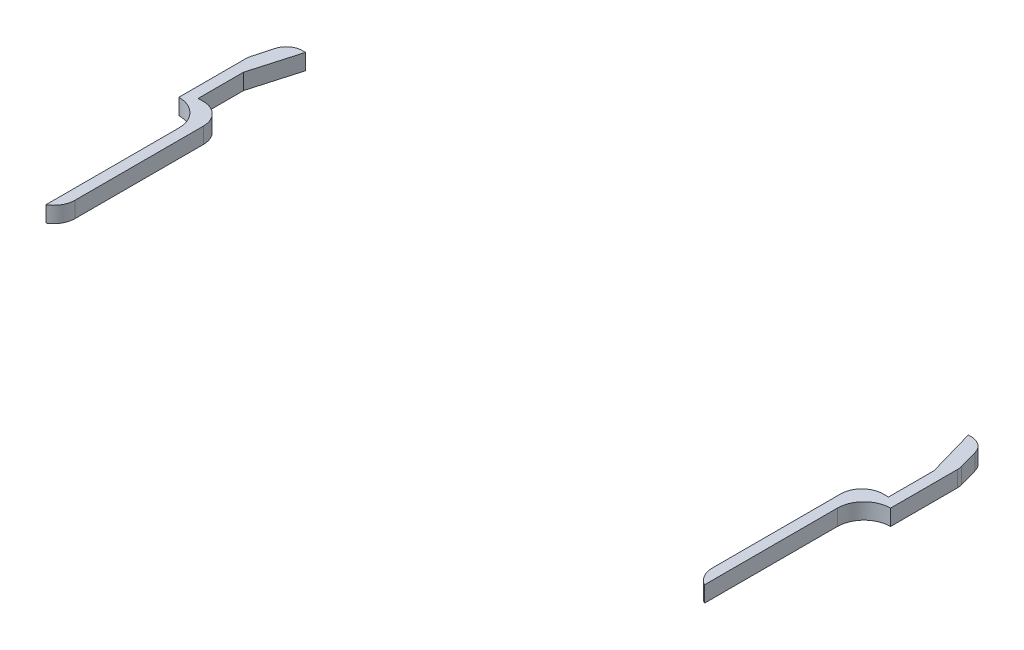
ISO-10303-21;
HEADER;
FILE_DESCRIPTION(('STEP AP214'),'2;1');
FILE_NAME('part.step','',(''),(''),'','','');
FILE_SCHEMA(('AUTOMOTIVE_DESIGN { 1 0 10303 214 1 1 1 1 }'));
ENDSEC;
DATA;
#1=APPLICATION_CONTEXT('core data for automotive mechanical design processes');
#2=APPLICATION_PROTOCOL_DEFINITION('international standard','automotive_design',2000,#1);
#3=PRODUCT_CONTEXT('',#1,'mechanical');
#4=PRODUCT('Part','Part','',(#3));
#5=PRODUCT_RELATED_PRODUCT_CATEGORY('part','',(#4));
#6=PRODUCT_DEFINITION_FORMATION('','',#4);
#7=PRODUCT_DEFINITION_CONTEXT('part definition',#1,'design');
#8=PRODUCT_DEFINITION('design','',#6,#7);
#9=PRODUCT_DEFINITION_SHAPE('','',#8);
#10=(LENGTH_UNIT() NAMED_UNIT(*) SI_UNIT(.MILLI.,.METRE.));
#11=(NAMED_UNIT(*) PLANE_ANGLE_UNIT() SI_UNIT($,.RADIAN.));
#12=(NAMED_UNIT(*) SI_UNIT($,.STERADIAN.) SOLID_ANGLE_UNIT());
#13=UNCERTAINTY_MEASURE_WITH_UNIT(LENGTH_MEASURE(1.E-05),#10,'distance_accuracy_value','');
#14=(GEOMETRIC_REPRESENTATION_CONTEXT(3) GLOBAL_UNCERTAINTY_ASSIGNED_CONTEXT((#13)) GLOBAL_UNIT_ASSIGNED_CONTEXT((#10,
#11,#12)) REPRESENTATION_CONTEXT('',''));
#15=CARTESIAN_POINT('',(0.,0.,0.));
#16=DIRECTION('',(0.,0.,1.));
#17=DIRECTION('',(1.,0.,0.));
#18=AXIS2_PLACEMENT_3D('',#15,#16,#17);
#19=CARTESIAN_POINT('',(3.344867395618,0.09847099073796,-1.724494712276));
#20=DIRECTION('',(0.,-1.,-4.115780449305E-12));
#21=DIRECTION('',(-0.999999768712327,0.,-0.000680128879099023));
#22=AXIS2_PLACEMENT_3D('',#19,#20,#21);
#23=CYLINDRICAL_SURFACE('',#22,0.25000000038);
#24=DIRECTION('',(-1.13301960372813E-11,-0.999999999724119,-2.34896254214928E-05));
#25=VECTOR('',#24,1.);
#26=CARTESIAN_POINT('',(3.094867750157,0.17347099085,-1.724659966049));
#27=LINE('',#26,#25);
#28=CARTESIAN_POINT('',(3.09486754473,0.173470990849,-1.724659966109));
#29=VERTEX_POINT('',#28);
#30=CARTESIAN_POINT('',(3.094867545513,0.0234709908457,-1.724663489553));
#31=VERTEX_POINT('',#30);
#32=EDGE_CURVE('P0_E265',#29,#31,#27,.T.);
#33=ORIENTED_EDGE('',*,*,#32,.T.);
#34=CARTESIAN_POINT('',(3.344867395618,0.02347099073796,-1.724494712276));
#35=DIRECTION('',(0.,1.,4.115780449305E-12));
#36=DIRECTION('',(-2.04079998811896E-07,4.11578044930492E-12,-0.999999999999979));
#37=AXIS2_PLACEMENT_3D('',#34,#35,#36);
#38=CIRCLE('',#37,0.25000000038);
#39=CARTESIAN_POINT('',(3.344867344598,0.02347099073899,-1.974494712656));
#40=VERTEX_POINT('',#39);
#41=EDGE_CURVE('P0_E197',#40,#31,#38,.T.);
#42=ORIENTED_EDGE('',*,*,#41,.F.);
#43=DIRECTION('',(0.,1.,2.563875038154E-12));
#44=VECTOR('',#43,1.);
#45=CARTESIAN_POINT('',(3.344867344598,0.02347099082296,-1.974494712656));
#46=LINE('',#45,#44);
#47=CARTESIAN_POINT('',(3.344867344598,0.173470990826,-1.974494712655));
#48=VERTEX_POINT('',#47);
#49=EDGE_CURVE('P0_E11',#40,#48,#46,.T.);
#50=ORIENTED_EDGE('',*,*,#49,.T.);
#51=CARTESIAN_POINT('',(3.344867395618,0.173470990738,-1.724494712275));
#52=DIRECTION('',(0.,-1.,-4.115780449305E-12));
#53=DIRECTION('',(-0.999999778692739,0.,-0.000665292772003927));
#54=AXIS2_PLACEMENT_3D('',#51,#52,#53);
#55=CIRCLE('',#54,0.25000000038);
#56=EDGE_CURVE('P0_E259',#29,#48,#55,.T.);
#57=ORIENTED_EDGE('',*,*,#56,.F.);
#58=EDGE_LOOP('',(#33,#42,#50,#57));
#59=FACE_BOUND('',#58,.T.);
#60=ADVANCED_FACE('P0_F17',(#59),#23,.F.);
#61=CARTESIAN_POINT('',(3.344867344598,0.09847099073978,-2.165876948645));
#62=DIRECTION('',(-1.,0.,0.));
#63=DIRECTION('',(0.,0.,1.));
#64=AXIS2_PLACEMENT_3D('',#61,#62,#63);
#65=PLANE('',#64);
#66=DIRECTION('',(0.,-1.370347422609E-12,1.));
#67=VECTOR('',#66,1.);
#68=CARTESIAN_POINT('',(3.344867344598,0.173470990827,-2.604892903076));
#69=LINE('',#68,#67);
#70=CARTESIAN_POINT('',(3.344867344598,0.173470990827,-2.604892903076));
#71=VERTEX_POINT('',#70);
#72=EDGE_CURVE('P0_E254',#71,#48,#69,.T.);
#73=ORIENTED_EDGE('',*,*,#72,.T.);
#74=ORIENTED_EDGE('',*,*,#49,.F.);
#75=DIRECTION('',(0.,1.118206402738E-12,-1.));
#76=VECTOR('',#75,1.);
#77=CARTESIAN_POINT('',(3.344867344598,0.02347099082296,-1.974494712656));
#78=LINE('',#77,#76);
#79=CARTESIAN_POINT('',(3.344867344598,0.02347099082367,-2.604892903077));
#80=VERTEX_POINT('',#79);
#81=EDGE_CURVE('P0_E202',#40,#80,#78,.T.);
#82=ORIENTED_EDGE('',*,*,#81,.T.);
#83=DIRECTION('',(0.,-1.,-4.967877960759E-12));
#84=VECTOR('',#83,1.);
#85=CARTESIAN_POINT('',(3.344867344598,0.173470990827,-2.604892903076));
#86=LINE('',#85,#84);
#87=EDGE_CURVE('P0_E28',#71,#80,#86,.T.);
#88=ORIENTED_EDGE('',*,*,#87,.F.);
#89=EDGE_LOOP('',(#73,#74,#82,#88));
#90=FACE_BOUND('',#89,.T.);
#91=ADVANCED_FACE('P0_F328',(#90),#65,.F.);
#92=CARTESIAN_POINT('',(3.194867344598,-0.172069009258,-2.604892903077));
#93=DIRECTION('',(0.,1.,4.115780449305E-12));
#94=DIRECTION('',(1.,0.,0.));
#95=AXIS2_PLACEMENT_3D('',#92,#93,#94);
#96=CYLINDRICAL_SURFACE('',#95,0.15);
#97=ORIENTED_EDGE('',*,*,#87,.T.);
#98=CARTESIAN_POINT('',(3.194867344598,0.02347099074158,-2.604892903077));
#99=DIRECTION('',(0.,-1.,-4.11578044930542E-12));
#100=DIRECTION('',(0.963419049721258,1.1030271227503E-12,-0.267999504914072));
#101=AXIS2_PLACEMENT_3D('',#98,#99,#100);
#102=CIRCLE('',#101,0.15);
#103=CARTESIAN_POINT('',(3.339380202057,0.02347099074175,-2.645092828814));
#104=VERTEX_POINT('',#103);
#105=EDGE_CURVE('P0_E244',#104,#80,#102,.T.);
#106=ORIENTED_EDGE('',*,*,#105,.F.);
#107=DIRECTION('',(-3.046451979511E-12,1.,-8.21268978733E-12));
#108=VECTOR('',#107,1.);
#109=CARTESIAN_POINT('',(3.33938020206,0.02347099082334,-2.645092828805));
#110=LINE('',#109,#108);
#111=CARTESIAN_POINT('',(3.33938020206,0.173470990826,-2.645092828806));
#112=VERTEX_POINT('',#111);
#113=EDGE_CURVE('P0_E284',#104,#112,#110,.T.);
#114=ORIENTED_EDGE('',*,*,#113,.T.);
#115=CARTESIAN_POINT('',(3.194867344598,0.173470990742,-2.604892903076));
#116=DIRECTION('',(0.,1.,4.115780449305E-12));
#117=DIRECTION('',(1.,0.,-2.812564995717E-12));
#118=AXIS2_PLACEMENT_3D('',#115,#116,#117);
#119=CIRCLE('',#118,0.15);
#120=EDGE_CURVE('P0_E258',#71,#112,#119,.T.);
#121=ORIENTED_EDGE('',*,*,#120,.F.);
#122=EDGE_LOOP('',(#97,#106,#114,#121));
#123=FACE_BOUND('',#122,.T.);
#124=ADVANCED_FACE('P0_F326',(#123),#96,.T.);
#125=CARTESIAN_POINT('',(3.258820051655,0.02347099074294,-2.934694795061));
#126=DIRECTION('',(0.963419049747726,1.10290913755269E-12,-0.267999504818924));
#127=DIRECTION('',(0.,-1.,-4.11534020668388E-12));
#128=AXIS2_PLACEMENT_3D('',#125,#126,#127);
#129=PLANE('',#128);
#130=DIRECTION('',(-0.267999504816139,2.55085621103232E-12,-0.963419049748501));
#131=VECTOR('',#130,1.);
#132=CARTESIAN_POINT('',(3.33938020206,0.173470990826,-2.645092828806));
#133=LINE('',#132,#131);
#134=CARTESIAN_POINT('',(3.289363734121,0.173470990827,-2.824894720775));
#135=VERTEX_POINT('',#134);
#136=EDGE_CURVE('P0_E277',#112,#135,#133,.T.);
#137=ORIENTED_EDGE('',*,*,#136,.F.);
#138=ORIENTED_EDGE('',*,*,#113,.F.);
#139=DIRECTION('',(0.267999504817068,-2.3530577757056E-12,0.963419049748243));
#140=VECTOR('',#139,1.);
#141=CARTESIAN_POINT('',(3.289363734119,0.02347099082378,-2.824894720783));
#142=LINE('',#141,#140);
#143=CARTESIAN_POINT('',(3.289363734119,0.02347099082378,-2.824894720783));
#144=VERTEX_POINT('',#143);
#145=EDGE_CURVE('P0_E249',#144,#104,#142,.T.);
#146=ORIENTED_EDGE('',*,*,#145,.F.);
#147=DIRECTION('',(-1.379045026293E-11,-1.,-5.232555129821E-11));
#148=VECTOR('',#147,1.);
#149=CARTESIAN_POINT('',(3.289363734121,0.173470990827,-2.824894720775));
#150=LINE('',#149,#148);
#151=EDGE_CURVE('P0_E52',#135,#144,#150,.T.);
#152=ORIENTED_EDGE('',*,*,#151,.F.);
#153=EDGE_LOOP('',(#137,#138,#146,#152));
#154=FACE_BOUND('',#153,.T.);
#155=ADVANCED_FACE('P0_F321',(#154),#129,.T.);
#156=CARTESIAN_POINT('',(3.144850876657,-0.172069009258,-2.784694795061));
#157=DIRECTION('',(0.,1.,4.11578044930515E-12));
#158=DIRECTION('',(0.963419049747726,1.10302712235769E-12,-0.267999504818924));
#159=AXIS2_PLACEMENT_3D('',#156,#157,#158);
#160=CYLINDRICAL_SURFACE('',#159,0.15);
#161=ORIENTED_EDGE('',*,*,#151,.T.);
#162=CARTESIAN_POINT('',(3.144850876657,0.02347099048028,-2.78469479506));
#163=DIRECTION('',(1.69860183147825E-09,-1.,-2.43851371294279E-09));
#164=DIRECTION('',(0.963419049747726,2.28998582994535E-09,-0.267999504818924));
#165=AXIS2_PLACEMENT_3D('',#162,#163,#164);
#166=CIRCLE('',#165,0.15);
#167=CARTESIAN_POINT('',(3.144250396063,0.02347099113924,-2.935001132263));
#168=VERTEX_POINT('',#167);
#169=EDGE_CURVE('P0_E253',#168,#144,#166,.T.);
#170=ORIENTED_EDGE('',*,*,#169,.F.);
#171=CARTESIAN_POINT('',(3.14426354898063,0.0234709911392389,-2.93469364520979));
#172=CARTESIAN_POINT('',(3.14426354898068,0.0297209911271455,-2.93469364520976));
#173=CARTESIAN_POINT('',(3.14426354898074,0.0359709911150522,-2.93469364520974));
#174=CARTESIAN_POINT('',(3.14426354898085,0.0484709910908655,-2.93469364520969));
#175=CARTESIAN_POINT('',(3.14426354898091,0.0547209910787722,-2.93469364520966));
#176=CARTESIAN_POINT('',(3.14426354898102,0.0672209910545855,-2.93469364520961));
#177=CARTESIAN_POINT('',(3.14426354898108,0.0734709910424922,-2.93469364520959));
#178=CARTESIAN_POINT('',(3.14426354898119,0.0859709910183055,-2.93469364520953));
#179=CARTESIAN_POINT('',(3.14426354898124,0.0922209910062122,-2.93469364520951));
#180=CARTESIAN_POINT('',(3.14426354898136,0.104720990982026,-2.93469364520946));
#181=CARTESIAN_POINT('',(3.14426354898141,0.110970990969932,-2.93469364520943));
#182=CARTESIAN_POINT('',(3.14426354898152,0.123470990945745,-2.93469364520938));
#183=CARTESIAN_POINT('',(3.14426354898158,0.129720990933652,-2.93469364520936));
#184=CARTESIAN_POINT('',(3.14426354898169,0.142220990909465,-2.93469364520931));
#185=CARTESIAN_POINT('',(3.14426354898175,0.148470990897372,-2.93469364520928));
#186=CARTESIAN_POINT('',(3.14426354898186,0.160970990873185,-2.93469364520923));
#187=CARTESIAN_POINT('',(3.14426354898192,0.167220990861092,-2.9346936452092));
#188=CARTESIAN_POINT('',(3.14426354898197,0.173470990848999,-2.93469364520918));
#189=B_SPLINE_CURVE_WITH_KNOTS('',3,(#171,#172,#173,#174,#175,#176,#177,#178,#179,#180,#181,
#182,#183,#184,#185,#186,#187,#188),.UNSPECIFIED.,.F.,.F.,(4,2,2,2,2,2,2,2,4),(0.,
0.01874999996372,0.03749999992744,0.0562499998911599,0.07499999985488,0.0937499998186,
0.11249999978232,0.13124999974604,0.14999999970976),.UNSPECIFIED.);
#190=CARTESIAN_POINT('',(3.144250396065,0.173470990849,-2.935001132262));
#191=VERTEX_POINT('',#190);
#192=EDGE_CURVE('P0_E41',#168,#191,#189,.T.);
#193=ORIENTED_EDGE('',*,*,#192,.T.);
#194=CARTESIAN_POINT('',(3.144850876657,0.17347099047,-2.78469479506));
#195=DIRECTION('',(-1.763157427369E-09,1.,2.53038077356571E-09));
#196=DIRECTION('',(-0.00391551783583466,2.52345770214914E-09,-0.999992334330657));
#197=AXIS2_PLACEMENT_3D('',#194,#195,#196);
#198=CIRCLE('',#197,0.15);
#199=EDGE_CURVE('P0_E281',#135,#191,#198,.T.);
#200=ORIENTED_EDGE('',*,*,#199,.F.);
#201=EDGE_LOOP('',(#161,#170,#193,#200));
#202=FACE_BOUND('',#201,.T.);
#203=ADVANCED_FACE('P0_F310',(#202),#160,.T.);
#204=CARTESIAN_POINT('',(2.619562849071,0.04847099094063,-2.9352118108));
#205=DIRECTION('',(0.,2.925491021119E-12,1.));
#206=DIRECTION('',(0.,-1.,2.925491021119E-12));
#207=AXIS2_PLACEMENT_3D('',#204,#205,#206);
#208=PLANE('',#207);
#209=DIRECTION('',(-1.,2.195915677822E-09,0.));
#210=VECTOR('',#209,1.);
#211=CARTESIAN_POINT('',(3.144262342351,0.173470990849,-2.9352118108));
#212=LINE('',#211,#210);
#213=CARTESIAN_POINT('',(3.115071497197,0.173470990913,-2.935211810801));
#214=VERTEX_POINT('',#213);
#215=EDGE_CURVE('P0_E287',#191,#214,#212,.T.);
#216=ORIENTED_EDGE('',*,*,#215,.F.);
#217=ORIENTED_EDGE('',*,*,#192,.F.);
#218=DIRECTION('',(1.,-2.118836520799E-09,0.));
#219=VECTOR('',#218,1.);
#220=CARTESIAN_POINT('',(3.115071497196,0.02347099090691,-2.9352118108));
#221=LINE('',#220,#219);
#222=CARTESIAN_POINT('',(3.115071497196,0.02347099090691,-2.9352118108));
#223=VERTEX_POINT('',#222);
#224=EDGE_CURVE('P0_E248',#223,#168,#221,.T.);
#225=ORIENTED_EDGE('',*,*,#224,.F.);
#226=DIRECTION('',(7.034373083744E-12,1.,-1.95103192853E-12));
#227=VECTOR('',#226,1.);
#228=CARTESIAN_POINT('',(3.115071497196,0.02347099090691,-2.9352118108));
#229=LINE('',#228,#227);
#230=EDGE_CURVE('P0_E236',#223,#214,#229,.T.);
#231=ORIENTED_EDGE('',*,*,#230,.T.);
#232=EDGE_LOOP('',(#216,#217,#225,#231));
#233=FACE_BOUND('',#232,.T.);
#234=ADVANCED_FACE('P0_F320',(#233),#208,.F.);
#235=CARTESIAN_POINT('',(-0.0001325658215223,0.17347099099,0.216375136312));
#236=DIRECTION('',(1.376096118273E-11,1.,-4.115174892906E-12));
#237=DIRECTION('',(1.,-1.376096118273E-11,0.));
#238=AXIS2_PLACEMENT_3D('',#235,#236,#237);
#239=PLANE('',#238);
#240=DIRECTION('',(0.,-4.115174892906E-12,-1.));
#241=VECTOR('',#240,1.);
#242=CARTESIAN_POINT('',(3.094867434177,0.173470990946,-0.009059700141154));
#243=LINE('',#242,#241);
#244=CARTESIAN_POINT('',(3.094868265418,0.173470990939,-0.475055215417));
#245=VERTEX_POINT('',#244);
#246=EDGE_CURVE('P0_E268',#245,#29,#243,.T.);
#247=ORIENTED_EDGE('',*,*,#246,.T.);
#248=ORIENTED_EDGE('',*,*,#56,.T.);
#249=ORIENTED_EDGE('',*,*,#72,.F.);
#250=ORIENTED_EDGE('',*,*,#120,.T.);
#251=ORIENTED_EDGE('',*,*,#136,.T.);
#252=ORIENTED_EDGE('',*,*,#199,.T.);
#253=ORIENTED_EDGE('',*,*,#215,.T.);
#254=DIRECTION('',(0.275637355814971,4.56400445811753E-11,0.9612616959389));
#255=VECTOR('',#254,1.);
#256=CARTESIAN_POINT('',(3.115071497197,0.173470990913,-2.935211810801));
#257=LINE('',#256,#255);
#258=CARTESIAN_POINT('',(3.244877979672,0.173470990934,-2.482522808908));
#259=VERTEX_POINT('',#258);
#260=EDGE_CURVE('P0_E195',#214,#259,#257,.T.);
#261=ORIENTED_EDGE('',*,*,#260,.T.);
#262=DIRECTION('',(-5.703387999284E-13,-3.044923538416E-12,-1.));
#263=VECTOR('',#262,1.);
#264=CARTESIAN_POINT('',(3.244877979672,0.173470990936,-2.055048864933));
#265=LINE('',#264,#263);
#266=CARTESIAN_POINT('',(3.244877979672,0.173470990936,-2.055048864933));
#267=VERTEX_POINT('',#266);
#268=EDGE_CURVE('P0_E205',#267,#259,#265,.T.);
#269=ORIENTED_EDGE('',*,*,#268,.F.);
#270=DIRECTION('',(1.,-2.89895885075E-11,0.));
#271=VECTOR('',#270,1.);
#272=CARTESIAN_POINT('',(3.194877979672,0.173470990937,-2.055048864933));
#273=LINE('',#272,#271);
#274=CARTESIAN_POINT('',(3.194877979672,0.173470990937,-2.055048864933));
#275=VERTEX_POINT('',#274);
#276=EDGE_CURVE('P0_E220',#275,#267,#273,.T.);
#277=ORIENTED_EDGE('',*,*,#276,.F.);
#278=CARTESIAN_POINT('',(3.194877979672,0.173470990939,-1.855048864933));
#279=DIRECTION('',(0.,1.,0.));
#280=DIRECTION('',(0.,0.,-1.));
#281=AXIS2_PLACEMENT_3D('',#278,#279,#280);
#282=CIRCLE('',#281,0.2);
#283=CARTESIAN_POINT('',(2.994877979672,0.173470990941,-1.855048864933));
#284=VERTEX_POINT('',#283);
#285=EDGE_CURVE('P0_E156',#275,#284,#282,.T.);
#286=ORIENTED_EDGE('',*,*,#285,.T.);
#287=DIRECTION('',(0.,-3.147906755622E-12,-1.));
#288=VECTOR('',#287,1.);
#289=CARTESIAN_POINT('',(2.994877979672,0.173470990944,-0.64825394569));
#290=LINE('',#289,#288);
#291=CARTESIAN_POINT('',(2.994877979672,0.173470990944,-0.64825394569));
#292=VERTEX_POINT('',#291);
#293=EDGE_CURVE('P0_E149',#292,#284,#290,.T.);
#294=ORIENTED_EDGE('',*,*,#293,.F.);
#295=CARTESIAN_POINT('',(3.194877979672,0.173470990945,-0.64825394569));
#296=DIRECTION('',(0.,1.,0.));
#297=DIRECTION('',(-1.,0.,0.));
#298=AXIS2_PLACEMENT_3D('',#295,#296,#297);
#299=CIRCLE('',#298,0.2);
#300=EDGE_CURVE('P0_E154',#292,#245,#299,.T.);
#301=ORIENTED_EDGE('',*,*,#300,.T.);
#302=EDGE_LOOP('',(#247,#248,#249,#250,#251,#252,#253,#261,#269,#277,#286,#294,#301));
#303=FACE_BOUND('',#302,.T.);
#304=ADVANCED_FACE('P0_F152',(#303),#239,.T.);
#305=CARTESIAN_POINT('',(3.094867434175,0.09847099093323,-0.234494536595));
#306=DIRECTION('',(1.,-2.16379854824E-11,0.));
#307=DIRECTION('',(-2.16379854824E-11,-1.,0.));
#308=AXIS2_PLACEMENT_3D('',#305,#306,#307);
#309=PLANE('',#308);
#310=DIRECTION('',(0.,4.871419776761E-12,1.));
#311=VECTOR('',#310,1.);
#312=CARTESIAN_POINT('',(3.094867434173,0.02347099094068,-0.234494536592));
#313=LINE('',#312,#311);
#314=CARTESIAN_POINT('',(3.094868265415,0.02347099093434,-0.475055215418));
#315=VERTEX_POINT('',#314);
#316=EDGE_CURVE('P0_E201',#31,#315,#313,.T.);
#317=ORIENTED_EDGE('',*,*,#316,.F.);
#318=ORIENTED_EDGE('',*,*,#32,.F.);
#319=ORIENTED_EDGE('',*,*,#246,.F.);
#320=DIRECTION('',(-2.16379854824E-11,-1.,-1.731038838592E-11));
#321=VECTOR('',#320,1.);
#322=CARTESIAN_POINT('',(3.094867434175,0.09847099094185,-0.47505730133));
#323=LINE('',#322,#321);
#324=EDGE_CURVE('P0_E162',#245,#315,#323,.T.);
#325=ORIENTED_EDGE('',*,*,#324,.T.);
#326=EDGE_LOOP('',(#317,#318,#319,#325));
#327=FACE_BOUND('',#326,.T.);
#328=ADVANCED_FACE('P0_F322',(#327),#309,.T.);
#329=CARTESIAN_POINT('',(2.98986743418,0.02347099094218,-0.234494536591));
#330=DIRECTION('',(1.426425543019E-11,1.,-4.871419776761E-12));
#331=DIRECTION('',(1.,-1.426425543019E-11,0.));
#332=AXIS2_PLACEMENT_3D('',#329,#330,#331);
#333=PLANE('',#332);
#334=DIRECTION('',(0.,-3.703319597402E-12,-1.));
#335=VECTOR('',#334,1.);
#336=CARTESIAN_POINT('',(2.994877979672,0.02347099093912,-0.64825394569));
#337=LINE('',#336,#335);
#338=CARTESIAN_POINT('',(2.994877979672,0.02347099093912,-0.64825394569));
#339=VERTEX_POINT('',#338);
#340=CARTESIAN_POINT('',(2.994877979672,0.02347099093466,-1.855048864933));
#341=VERTEX_POINT('',#340);
#342=EDGE_CURVE('P0_E168',#339,#341,#337,.T.);
#343=ORIENTED_EDGE('',*,*,#342,.T.);
#344=CARTESIAN_POINT('',(3.194877979672,0.0234709909326,-1.855048864933));
#345=DIRECTION('',(0.,-1.,0.));
#346=DIRECTION('',(-1.,0.,0.));
#347=AXIS2_PLACEMENT_3D('',#344,#345,#346);
#348=CIRCLE('',#347,0.2);
#349=CARTESIAN_POINT('',(3.194877979672,0.02347099093101,-2.055048864933));
#350=VERTEX_POINT('',#349);
#351=EDGE_CURVE('P0_E216',#341,#350,#348,.T.);
#352=ORIENTED_EDGE('',*,*,#351,.T.);
#353=DIRECTION('',(1.,-3.121648772808E-11,0.));
#354=VECTOR('',#353,1.);
#355=CARTESIAN_POINT('',(3.194877979672,0.02347099093101,-2.055048864933));
#356=LINE('',#355,#354);
#357=CARTESIAN_POINT('',(3.244877979672,0.02347099092944,-2.055048864933));
#358=VERTEX_POINT('',#357);
#359=EDGE_CURVE('P0_E209',#350,#358,#356,.T.);
#360=ORIENTED_EDGE('',*,*,#359,.T.);
#361=DIRECTION('',(-5.703387999284E-13,-3.658927279482E-12,-1.));
#362=VECTOR('',#361,1.);
#363=CARTESIAN_POINT('',(3.244877979672,0.02347099092944,-2.055048864933));
#364=LINE('',#363,#362);
#365=CARTESIAN_POINT('',(3.244877979672,0.02347099092788,-2.482522808908));
#366=VERTEX_POINT('',#365);
#367=EDGE_CURVE('P0_E191',#358,#366,#364,.T.);
#368=ORIENTED_EDGE('',*,*,#367,.T.);
#369=DIRECTION('',(-0.275637355818008,-4.45383769008214E-11,-0.961261695938029));
#370=VECTOR('',#369,1.);
#371=CARTESIAN_POINT('',(3.244877979672,0.02347099092788,-2.482522808908));
#372=LINE('',#371,#370);
#373=EDGE_CURVE('P0_E240',#366,#223,#372,.T.);
#374=ORIENTED_EDGE('',*,*,#373,.T.);
#375=ORIENTED_EDGE('',*,*,#224,.T.);
#376=ORIENTED_EDGE('',*,*,#169,.T.);
#377=ORIENTED_EDGE('',*,*,#145,.T.);
#378=ORIENTED_EDGE('',*,*,#105,.T.);
#379=ORIENTED_EDGE('',*,*,#81,.F.);
#380=ORIENTED_EDGE('',*,*,#41,.T.);
#381=ORIENTED_EDGE('',*,*,#316,.T.);
#382=CARTESIAN_POINT('',(3.194877979672,0.02347099094013,-0.64825394569));
#383=DIRECTION('',(0.,-1.,0.));
#384=DIRECTION('',(-0.500048278145058,0.,0.865997528590101));
#385=AXIS2_PLACEMENT_3D('',#382,#383,#384);
#386=CIRCLE('',#385,0.2);
#387=EDGE_CURVE('P0_E173',#315,#339,#386,.T.);
#388=ORIENTED_EDGE('',*,*,#387,.T.);
#389=EDGE_LOOP('',(#343,#352,#360,#368,#374,#375,#376,#377,#378,#379,#380,#381,#388));
#390=FACE_BOUND('',#389,.T.);
#391=ADVANCED_FACE('P0_F344',(#390),#333,.F.);
#392=CARTESIAN_POINT('',(3.244877979672,0.423470990942,-2.482522808907));
#393=DIRECTION('',(-0.961261695938029,0.,0.275637355818008));
#394=DIRECTION('',(0.,1.,0.));
#395=AXIS2_PLACEMENT_3D('',#392,#393,#394);
#396=PLANE('',#395);
#397=ORIENTED_EDGE('',*,*,#260,.F.);
#398=ORIENTED_EDGE('',*,*,#230,.F.);
#399=ORIENTED_EDGE('',*,*,#373,.F.);
#400=DIRECTION('',(0.,-1.,0.));
#401=VECTOR('',#400,1.);
#402=CARTESIAN_POINT('',(3.244877979672,0.423470990942,-2.482522808907));
#403=LINE('',#402,#401);
#404=EDGE_CURVE('P0_E196',#259,#366,#403,.T.);
#405=ORIENTED_EDGE('',*,*,#404,.F.);
#406=EDGE_LOOP('',(#397,#398,#399,#405));
#407=FACE_BOUND('',#406,.T.);
#408=ADVANCED_FACE('P0_F513',(#407),#396,.T.);
#409=CARTESIAN_POINT('',(3.244877979672,0.423470990942,-2.055048864933));
#410=DIRECTION('',(-1.,0.,0.));
#411=DIRECTION('',(0.,0.,1.));
#412=AXIS2_PLACEMENT_3D('',#409,#410,#411);
#413=PLANE('',#412);
#414=ORIENTED_EDGE('',*,*,#268,.T.);
#415=ORIENTED_EDGE('',*,*,#404,.T.);
#416=ORIENTED_EDGE('',*,*,#367,.F.);
#417=DIRECTION('',(0.,-1.,0.));
#418=VECTOR('',#417,1.);
#419=CARTESIAN_POINT('',(3.244877979672,0.423470990942,-2.055048864933));
#420=LINE('',#419,#418);
#421=EDGE_CURVE('P0_E224',#267,#358,#420,.T.);
#422=ORIENTED_EDGE('',*,*,#421,.F.);
#423=EDGE_LOOP('',(#414,#415,#416,#422));
#424=FACE_BOUND('',#423,.T.);
#425=ADVANCED_FACE('P0_F497',(#424),#413,.T.);
#426=CARTESIAN_POINT('',(3.194877979672,0.423470990942,-2.055048864933));
#427=DIRECTION('',(0.,0.,-1.));
#428=DIRECTION('',(0.,-1.,0.));
#429=AXIS2_PLACEMENT_3D('',#426,#427,#428);
#430=PLANE('',#429);
#431=ORIENTED_EDGE('',*,*,#276,.T.);
#432=ORIENTED_EDGE('',*,*,#421,.T.);
#433=ORIENTED_EDGE('',*,*,#359,.F.);
#434=DIRECTION('',(0.,-1.,0.));
#435=VECTOR('',#434,1.);
#436=CARTESIAN_POINT('',(3.194877979672,0.423470990942,-2.055048864933));
#437=LINE('',#436,#435);
#438=EDGE_CURVE('P0_E212',#275,#350,#437,.T.);
#439=ORIENTED_EDGE('',*,*,#438,.F.);
#440=EDGE_LOOP('',(#431,#432,#433,#439));
#441=FACE_BOUND('',#440,.T.);
#442=ADVANCED_FACE('P0_F492',(#441),#430,.T.);
#443=CARTESIAN_POINT('',(3.194877979672,0.423470990942,-1.855048864933));
#444=DIRECTION('',(0.,-1.,0.));
#445=DIRECTION('',(0.,0.,1.));
#446=AXIS2_PLACEMENT_3D('',#443,#444,#445);
#447=CYLINDRICAL_SURFACE('',#446,0.2);
#448=ORIENTED_EDGE('',*,*,#285,.F.);
#449=ORIENTED_EDGE('',*,*,#438,.T.);
#450=ORIENTED_EDGE('',*,*,#351,.F.);
#451=DIRECTION('',(0.,-1.,0.));
#452=VECTOR('',#451,1.);
#453=CARTESIAN_POINT('',(2.994877979672,0.423470990942,-1.855048864933));
#454=LINE('',#453,#452);
#455=EDGE_CURVE('P0_E161',#284,#341,#454,.T.);
#456=ORIENTED_EDGE('',*,*,#455,.F.);
#457=EDGE_LOOP('',(#448,#449,#450,#456));
#458=FACE_BOUND('',#457,.T.);
#459=ADVANCED_FACE('P0_F472',(#458),#447,.T.);
#460=CARTESIAN_POINT('',(2.994877979672,0.423470990942,-0.64825394569));
#461=DIRECTION('',(-1.,0.,0.));
#462=DIRECTION('',(0.,0.,1.));
#463=AXIS2_PLACEMENT_3D('',#460,#461,#462);
#464=PLANE('',#463);
#465=ORIENTED_EDGE('',*,*,#293,.T.);
#466=ORIENTED_EDGE('',*,*,#455,.T.);
#467=ORIENTED_EDGE('',*,*,#342,.F.);
#468=DIRECTION('',(0.,-1.,0.));
#469=VECTOR('',#468,1.);
#470=CARTESIAN_POINT('',(2.994877979672,0.423470990942,-0.64825394569));
#471=LINE('',#470,#469);
#472=EDGE_CURVE('P0_E165',#292,#339,#471,.T.);
#473=ORIENTED_EDGE('',*,*,#472,.F.);
#474=EDGE_LOOP('',(#465,#466,#467,#473));
#475=FACE_BOUND('',#474,.T.);
#476=ADVANCED_FACE('P0_F166',(#475),#464,.T.);
#477=CARTESIAN_POINT('',(3.194877979672,0.423470990942,-0.64825394569));
#478=DIRECTION('',(0.,-1.,0.));
#479=DIRECTION('',(1.,0.,0.));
#480=AXIS2_PLACEMENT_3D('',#477,#478,#479);
#481=CYLINDRICAL_SURFACE('',#480,0.2);
#482=ORIENTED_EDGE('',*,*,#300,.F.);
#483=ORIENTED_EDGE('',*,*,#472,.T.);
#484=ORIENTED_EDGE('',*,*,#387,.F.);
#485=ORIENTED_EDGE('',*,*,#324,.F.);
#486=EDGE_LOOP('',(#482,#483,#484,#485));
#487=FACE_BOUND('',#486,.T.);
#488=ADVANCED_FACE('P0_F176',(#487),#481,.T.);
#489=CLOSED_SHELL('',(#60,#91,#124,#155,#203,#234,#304,#328,#391,#408,#425,#442,#459,#476,#488));
#490=MANIFOLD_SOLID_BREP('P0_B1',#489);
#491=CARTESIAN_POINT('',(-3.032206099957,0.423470990942,-3.225048864931));
#492=DIRECTION('',(0.961261695938029,0.,0.275637355818008));
#493=DIRECTION('',(0.,-1.,0.));
#494=AXIS2_PLACEMENT_3D('',#491,#492,#493);
#495=PLANE('',#494);
#496=DIRECTION('',(8.388710513844E-13,1.,-2.925491021119E-12));
#497=VECTOR('',#496,1.);
#498=CARTESIAN_POINT('',(-3.115315537852,-0.08902900905705,-2.9352118108));
#499=LINE('',#498,#497);
#500=CARTESIAN_POINT('',(-3.115315537852,0.02347099098635,-2.9352118108));
#501=VERTEX_POINT('',#500);
#502=CARTESIAN_POINT('',(-3.115315538233,0.17347099102,-2.935211810513));
#503=VERTEX_POINT('',#502);
#504=EDGE_CURVE('P1_E250',#501,#503,#499,.T.);
#505=ORIENTED_EDGE('',*,*,#504,.T.);
#506=DIRECTION('',(0.275637355817084,-5.8768177700188E-12,-0.961261695938294));
#507=VECTOR('',#506,1.);
#508=CARTESIAN_POINT('',(-3.245122020328,0.173470991023,-2.482522808908));
#509=LINE('',#508,#507);
#510=CARTESIAN_POINT('',(-3.245122020328,0.173470991023,-2.482522808908));
#511=VERTEX_POINT('',#510);
#512=EDGE_CURVE('P1_E207',#511,#503,#509,.T.);
#513=ORIENTED_EDGE('',*,*,#512,.F.);
#514=DIRECTION('',(0.,-1.,0.));
#515=VECTOR('',#514,1.);
#516=CARTESIAN_POINT('',(-3.245122020328,0.423470990942,-2.482522808907));
#517=LINE('',#516,#515);
#518=CARTESIAN_POINT('',(-3.245122020328,0.02347099101984,-2.482522808908));
#519=VERTEX_POINT('',#518);
#520=EDGE_CURVE('P1_E11',#511,#519,#517,.T.);
#521=ORIENTED_EDGE('',*,*,#520,.T.);
#522=DIRECTION('',(-0.275637355814971,7.11129114076226E-11,0.9612616959389));
#523=VECTOR('',#522,1.);
#524=CARTESIAN_POINT('',(-3.115315537852,0.02347099098635,-2.9352118108));
#525=LINE('',#524,#523);
#526=EDGE_CURVE('P1_E267',#501,#519,#525,.T.);
#527=ORIENTED_EDGE('',*,*,#526,.F.);
#528=EDGE_LOOP('',(#505,#513,#521,#527));
#529=FACE_BOUND('',#528,.T.);
#530=ADVANCED_FACE('P1_F17',(#529),#495,.T.);
#531=CARTESIAN_POINT('',(-3.245122020328,0.423470990942,-2.482522808907));
#532=DIRECTION('',(1.,0.,0.));
#533=DIRECTION('',(0.,1.,0.));
#534=AXIS2_PLACEMENT_3D('',#531,#532,#533);
#535=PLANE('',#534);
#536=DIRECTION('',(0.,3.897964425649E-12,1.));
#537=VECTOR('',#536,1.);
#538=CARTESIAN_POINT('',(-3.245122020328,0.173470991023,-2.482522808908));
#539=LINE('',#538,#537);
#540=CARTESIAN_POINT('',(-3.245122020328,0.173470991025,-2.055048864933));
#541=VERTEX_POINT('',#540);
#542=EDGE_CURVE('P1_E190',#511,#541,#539,.T.);
#543=ORIENTED_EDGE('',*,*,#542,.T.);
#544=DIRECTION('',(0.,-1.,0.));
#545=VECTOR('',#544,1.);
#546=CARTESIAN_POINT('',(-3.245122020328,0.423470990942,-2.055048864933));
#547=LINE('',#546,#545);
#548=CARTESIAN_POINT('',(-3.245122020328,0.02347099102178,-2.055048864933));
#549=VERTEX_POINT('',#548);
#550=EDGE_CURVE('P1_E29',#541,#549,#547,.T.);
#551=ORIENTED_EDGE('',*,*,#550,.T.);
#552=DIRECTION('',(0.,4.546616054022E-12,1.));
#553=VECTOR('',#552,1.);
#554=CARTESIAN_POINT('',(-3.245122020328,0.02347099101984,-2.482522808908));
#555=LINE('',#554,#553);
#556=EDGE_CURVE('P1_E271',#519,#549,#555,.T.);
#557=ORIENTED_EDGE('',*,*,#556,.F.);
#558=ORIENTED_EDGE('',*,*,#520,.F.);
#559=EDGE_LOOP('',(#543,#551,#557,#558));
#560=FACE_BOUND('',#559,.T.);
#561=ADVANCED_FACE('P1_F19',(#560),#535,.T.);
#562=CARTESIAN_POINT('',(-3.245122020328,0.423470990942,-2.055048864933));
#563=DIRECTION('',(0.,0.,-1.));
#564=DIRECTION('',(0.,-1.,0.));
#565=AXIS2_PLACEMENT_3D('',#562,#563,#564);
#566=PLANE('',#565);
#567=DIRECTION('',(1.,-1.3593015602E-11,0.));
#568=VECTOR('',#567,1.);
#569=CARTESIAN_POINT('',(-3.245122020328,0.173470991025,-2.055048864933));
#570=LINE('',#569,#568);
#571=CARTESIAN_POINT('',(-3.195122020328,0.173470991024,-2.055048864933));
#572=VERTEX_POINT('',#571);
#573=EDGE_CURVE('P1_E194',#541,#572,#570,.T.);
#574=ORIENTED_EDGE('',*,*,#573,.T.);
#575=DIRECTION('',(0.,-1.,0.));
#576=VECTOR('',#575,1.);
#577=CARTESIAN_POINT('',(-3.195122020328,0.423470990942,-2.055048864933));
#578=LINE('',#577,#576);
#579=CARTESIAN_POINT('',(-3.195122020328,0.02347099102113,-2.055048864933));
#580=VERTEX_POINT('',#579);
#581=EDGE_CURVE('P1_E51',#572,#580,#578,.T.);
#582=ORIENTED_EDGE('',*,*,#581,.T.);
#583=DIRECTION('',(1.,-1.294742091318E-11,0.));
#584=VECTOR('',#583,1.);
#585=CARTESIAN_POINT('',(-3.245122020328,0.02347099102178,-2.055048864933));
#586=LINE('',#585,#584);
#587=EDGE_CURVE('P1_E254',#549,#580,#586,.T.);
#588=ORIENTED_EDGE('',*,*,#587,.F.);
#589=ORIENTED_EDGE('',*,*,#550,.F.);
#590=EDGE_LOOP('',(#574,#582,#588,#589));
#591=FACE_BOUND('',#590,.T.);
#592=ADVANCED_FACE('P1_F323',(#591),#566,.T.);
#593=CARTESIAN_POINT('',(-3.195122020328,0.423470990942,-1.855048864933));
#594=DIRECTION('',(0.,-1.,0.));
#595=DIRECTION('',(1.,0.,0.));
#596=AXIS2_PLACEMENT_3D('',#593,#594,#595);
#597=CYLINDRICAL_SURFACE('',#596,0.2);
#598=CARTESIAN_POINT('',(-3.195122020328,0.173470991023,-1.855048864933));
#599=DIRECTION('',(0.,1.,0.));
#600=DIRECTION('',(1.,0.,0.));
#601=AXIS2_PLACEMENT_3D('',#598,#599,#600);
#602=CIRCLE('',#601,0.2);
#603=CARTESIAN_POINT('',(-2.995122020328,0.173470991023,-1.855048864933));
#604=VERTEX_POINT('',#603);
#605=EDGE_CURVE('P1_E197',#604,#572,#602,.T.);
#606=ORIENTED_EDGE('',*,*,#605,.F.);
#607=DIRECTION('',(0.,-1.,0.));
#608=VECTOR('',#607,1.);
#609=CARTESIAN_POINT('',(-2.995122020328,0.423470990942,-1.855048864933));
#610=LINE('',#609,#608);
#611=CARTESIAN_POINT('',(-2.995122020328,0.02347099101998,-1.855048864933));
#612=VERTEX_POINT('',#611);
#613=EDGE_CURVE('P1_E283',#604,#612,#610,.T.);
#614=ORIENTED_EDGE('',*,*,#613,.T.);
#615=CARTESIAN_POINT('',(-3.195122020328,0.02347099101998,-1.855048864933));
#616=DIRECTION('',(0.,-1.,0.));
#617=DIRECTION('',(0.,0.,-1.));
#618=AXIS2_PLACEMENT_3D('',#615,#616,#617);
#619=CIRCLE('',#618,0.2);
#620=EDGE_CURVE('P1_E255',#580,#612,#619,.T.);
#621=ORIENTED_EDGE('',*,*,#620,.F.);
#622=ORIENTED_EDGE('',*,*,#581,.F.);
#623=EDGE_LOOP('',(#606,#614,#621,#622));
#624=FACE_BOUND('',#623,.T.);
#625=ADVANCED_FACE('P1_F320',(#624),#597,.T.);
#626=CARTESIAN_POINT('',(-2.995122020328,0.423470990942,-1.855048864933));
#627=DIRECTION('',(1.,0.,0.));
#628=DIRECTION('',(0.,1.,0.));
#629=AXIS2_PLACEMENT_3D('',#626,#627,#628);
#630=PLANE('',#629);
#631=DIRECTION('',(0.,2.863082016188E-12,1.));
#632=VECTOR('',#631,1.);
#633=CARTESIAN_POINT('',(-2.995122020328,0.173470991023,-1.855048864933));
#634=LINE('',#633,#632);
#635=CARTESIAN_POINT('',(-2.995122020328,0.173470991027,-0.64825394569));
#636=VERTEX_POINT('',#635);
#637=EDGE_CURVE('P1_E206',#604,#636,#634,.T.);
#638=ORIENTED_EDGE('',*,*,#637,.T.);
#639=DIRECTION('',(0.,-1.,0.));
#640=VECTOR('',#639,1.);
#641=CARTESIAN_POINT('',(-2.995122020328,0.423470990942,-0.64825394569));
#642=LINE('',#641,#640);
#643=CARTESIAN_POINT('',(-2.995122020328,0.02347099102486,-0.64825394569));
#644=VERTEX_POINT('',#643);
#645=EDGE_CURVE('P1_E193',#636,#644,#642,.T.);
#646=ORIENTED_EDGE('',*,*,#645,.T.);
#647=DIRECTION('',(0.,3.410767054959E-12,1.));
#648=VECTOR('',#647,1.);
#649=CARTESIAN_POINT('',(-2.995122020328,0.02347099102074,-1.855048864933));
#650=LINE('',#649,#648);
#651=EDGE_CURVE('P1_E249',#612,#644,#650,.T.);
#652=ORIENTED_EDGE('',*,*,#651,.F.);
#653=ORIENTED_EDGE('',*,*,#613,.F.);
#654=EDGE_LOOP('',(#638,#646,#652,#653));
#655=FACE_BOUND('',#654,.T.);
#656=ADVANCED_FACE('P1_F322',(#655),#630,.T.);
#657=CARTESIAN_POINT('',(-3.195122020328,0.423470990942,-0.64825394569));
#658=DIRECTION('',(0.,-1.,0.));
#659=DIRECTION('',(0.499985344359162,0.,0.86603386505728));
#660=AXIS2_PLACEMENT_3D('',#657,#658,#659);
#661=CYLINDRICAL_SURFACE('',#660,0.2);
#662=CARTESIAN_POINT('',(-3.195122020328,0.173470991028,-0.64825394569));
#663=DIRECTION('',(0.,1.,0.));
#664=DIRECTION('',(0.499952064090815,0.,0.86605307782568));
#665=AXIS2_PLACEMENT_3D('',#662,#663,#664);
#666=CIRCLE('',#665,0.2);
#667=CARTESIAN_POINT('',(-3.09513170207,0.173470991021,-0.47504255265));
#668=VERTEX_POINT('',#667);
#669=EDGE_CURVE('P1_E202',#668,#636,#666,.T.);
#670=ORIENTED_EDGE('',*,*,#669,.F.);
#671=DIRECTION('',(2.163798548262E-11,1.,-1.73103883861E-11));
#672=VECTOR('',#671,1.);
#673=CARTESIAN_POINT('',(-3.095132565825,0.09847099099516,-0.475040428535));
#674=LINE('',#673,#672);
#675=CARTESIAN_POINT('',(-3.09513170209,0.02347099104241,-0.475042552619));
#676=VERTEX_POINT('',#675);
#677=EDGE_CURVE('P1_E214',#676,#668,#674,.T.);
#678=ORIENTED_EDGE('',*,*,#677,.F.);
#679=CARTESIAN_POINT('',(-3.195122020328,0.02347099102645,-0.64825394569));
#680=DIRECTION('',(0.,-1.,0.));
#681=DIRECTION('',(1.,0.,0.));
#682=AXIS2_PLACEMENT_3D('',#679,#680,#681);
#683=CIRCLE('',#682,0.2);
#684=EDGE_CURVE('P1_E244',#644,#676,#683,.T.);
#685=ORIENTED_EDGE('',*,*,#684,.F.);
#686=ORIENTED_EDGE('',*,*,#645,.F.);
#687=EDGE_LOOP('',(#670,#678,#685,#686));
#688=FACE_BOUND('',#687,.T.);
#689=ADVANCED_FACE('P1_F333',(#688),#661,.T.);
#690=CARTESIAN_POINT('',(-0.0001325658215223,0.17347099099,0.216375136312));
#691=DIRECTION('',(1.376096118273E-11,1.,-4.115174892906E-12));
#692=DIRECTION('',(1.,-1.376096118273E-11,0.));
#693=AXIS2_PLACEMENT_3D('',#690,#691,#692);
#694=PLANE('',#693);
#695=ORIENTED_EDGE('',*,*,#512,.T.);
#696=DIRECTION('',(1.,-1.376096118273E-11,0.));
#697=VECTOR('',#696,1.);
#698=CARTESIAN_POINT('',(1.309715141626,0.173470990959,-2.9352118108));
#699=LINE('',#698,#697);
#700=CARTESIAN_POINT('',(-3.14452440925,0.173470990928,-2.934973347093));
#701=VERTEX_POINT('',#700);
#702=EDGE_CURVE('P1_E154',#701,#503,#699,.T.);
#703=ORIENTED_EDGE('',*,*,#702,.F.);
#704=CARTESIAN_POINT('',(-3.145116084041,0.173470990416,-2.78469479506));
#705=DIRECTION('',(2.17209931630235E-09,1.,3.42332870545482E-09));
#706=DIRECTION('',(-0.963419049753579,3.01009225710469E-09,-0.267999504797883));
#707=AXIS2_PLACEMENT_3D('',#704,#705,#706);
#708=CIRCLE('',#707,0.15);
#709=CARTESIAN_POINT('',(-3.289628941503,0.173470990867,-2.824894720779));
#710=VERTEX_POINT('',#709);
#711=EDGE_CURVE('P1_E147',#701,#710,#708,.T.);
#712=ORIENTED_EDGE('',*,*,#711,.T.);
#713=DIRECTION('',(-0.267999504817068,0.,0.963419049748243));
#714=VECTOR('',#713,1.);
#715=CARTESIAN_POINT('',(-3.289628941503,0.173470990867,-2.824894720779));
#716=LINE('',#715,#714);
#717=CARTESIAN_POINT('',(-3.339645411984,0.173470990867,-2.645092819666));
#718=VERTEX_POINT('',#717);
#719=EDGE_CURVE('P1_E151',#710,#718,#716,.T.);
#720=ORIENTED_EDGE('',*,*,#719,.T.);
#721=CARTESIAN_POINT('',(-3.195132554522,0.173470990742,-2.604892893946));
#722=DIRECTION('',(0.,1.,4.11588217608919E-12));
#723=DIRECTION('',(-0.9634190497619,1.10305438487588E-12,-0.267999504767972));
#724=AXIS2_PLACEMENT_3D('',#721,#722,#723);
#725=CIRCLE('',#724,0.15);
#726=CARTESIAN_POINT('',(-3.345132554522,0.173470990868,-2.604892893946));
#727=VERTEX_POINT('',#726);
#728=EDGE_CURVE('P1_E182',#718,#727,#725,.T.);
#729=ORIENTED_EDGE('',*,*,#728,.T.);
#730=DIRECTION('',(-1.167886136731E-10,1.37017132789E-12,-1.));
#731=VECTOR('',#730,1.);
#732=CARTESIAN_POINT('',(-3.345132554448,0.173470990867,-1.974494712655));
#733=LINE('',#732,#731);
#734=CARTESIAN_POINT('',(-3.345132554448,0.173470990867,-1.974494712655));
#735=VERTEX_POINT('',#734);
#736=EDGE_CURVE('P1_E232',#735,#727,#733,.T.);
#737=ORIENTED_EDGE('',*,*,#736,.F.);
#738=CARTESIAN_POINT('',(-3.345132605102,0.173470990738,-1.724494712275));
#739=DIRECTION('',(0.,-1.,-4.115780449305E-12));
#740=DIRECTION('',(2.02320000445296E-07,4.11578044930492E-12,-0.99999999999998));
#741=AXIS2_PLACEMENT_3D('',#738,#739,#740);
#742=CIRCLE('',#741,0.25000000038);
#743=CARTESIAN_POINT('',(-3.095132491952,0.173470990896,-1.724648029587));
#744=VERTEX_POINT('',#743);
#745=EDGE_CURVE('P1_E218',#735,#744,#742,.T.);
#746=ORIENTED_EDGE('',*,*,#745,.T.);
#747=DIRECTION('',(0.,4.115174892906E-12,1.));
#748=VECTOR('',#747,1.);
#749=CARTESIAN_POINT('',(-3.095132565823,0.173470991032,-0.009059700141154));
#750=LINE('',#749,#748);
#751=EDGE_CURVE('P1_E221',#744,#668,#750,.T.);
#752=ORIENTED_EDGE('',*,*,#751,.T.);
#753=ORIENTED_EDGE('',*,*,#669,.T.);
#754=ORIENTED_EDGE('',*,*,#637,.F.);
#755=ORIENTED_EDGE('',*,*,#605,.T.);
#756=ORIENTED_EDGE('',*,*,#573,.F.);
#757=ORIENTED_EDGE('',*,*,#542,.F.);
#758=EDGE_LOOP('',(#695,#703,#712,#720,#729,#737,#746,#752,#753,#754,#755,#756,#757));
#759=FACE_BOUND('',#758,.T.);
#760=ADVANCED_FACE('P1_F149',(#759),#694,.T.);
#761=CARTESIAN_POINT('',(-3.095132565825,0.09847099105705,-0.234494536595));
#762=DIRECTION('',(1.,-2.163798548262E-11,0.));
#763=DIRECTION('',(-2.163798548262E-11,-1.,0.));
#764=AXIS2_PLACEMENT_3D('',#761,#762,#763);
#765=PLANE('',#764);
#766=ORIENTED_EDGE('',*,*,#751,.F.);
#767=DIRECTION('',(1.059596854693E-11,1.,-1.363063735943E-09));
#768=VECTOR('',#767,1.);
#769=CARTESIAN_POINT('',(-3.095132258301,0.02347099089558,-1.724648029492));
#770=LINE('',#769,#768);
#771=CARTESIAN_POINT('',(-3.095132491954,0.02347099089437,-1.724648029382));
#772=VERTEX_POINT('',#771);
#773=EDGE_CURVE('P1_E211',#772,#744,#770,.T.);
#774=ORIENTED_EDGE('',*,*,#773,.F.);
#775=DIRECTION('',(0.,-4.871419776761E-12,-1.));
#776=VECTOR('',#775,1.);
#777=CARTESIAN_POINT('',(-3.095132565827,0.02347099102898,-0.234494536592));
#778=LINE('',#777,#776);
#779=EDGE_CURVE('P1_E248',#676,#772,#778,.T.);
#780=ORIENTED_EDGE('',*,*,#779,.F.);
#781=ORIENTED_EDGE('',*,*,#677,.T.);
#782=EDGE_LOOP('',(#766,#774,#780,#781));
#783=FACE_BOUND('',#782,.T.);
#784=ADVANCED_FACE('P1_F329',(#783),#765,.F.);
#785=CARTESIAN_POINT('',(2.98986743418,0.02347099094218,-0.234494536591));
#786=DIRECTION('',(1.426425543019E-11,1.,-4.871419776761E-12));
#787=DIRECTION('',(1.,-1.426425543019E-11,0.));
#788=AXIS2_PLACEMENT_3D('',#785,#786,#787);
#789=PLANE('',#788);
#790=ORIENTED_EDGE('',*,*,#587,.T.);
#791=ORIENTED_EDGE('',*,*,#620,.T.);
#792=ORIENTED_EDGE('',*,*,#651,.T.);
#793=ORIENTED_EDGE('',*,*,#684,.T.);
#794=ORIENTED_EDGE('',*,*,#779,.T.);
#795=CARTESIAN_POINT('',(-3.345132605102,0.02347099073796,-1.724494712276));
#796=DIRECTION('',(0.,1.,4.115780449305E-12));
#797=DIRECTION('',(0.99999982524765,0.,-0.000591189198932993));
#798=AXIS2_PLACEMENT_3D('',#795,#796,#797);
#799=CIRCLE('',#798,0.25000000038);
#800=CARTESIAN_POINT('',(-3.345132554522,0.02347099073899,-1.974494712656));
#801=VERTEX_POINT('',#800);
#802=EDGE_CURVE('P1_E189',#772,#801,#799,.T.);
#803=ORIENTED_EDGE('',*,*,#802,.T.);
#804=DIRECTION('',(1.167886136731E-10,-1.118145879552E-12,1.));
#805=VECTOR('',#804,1.);
#806=CARTESIAN_POINT('',(-3.345132554522,0.02347099086608,-2.604892893947));
#807=LINE('',#806,#805);
#808=CARTESIAN_POINT('',(-3.345132554522,0.02347099086608,-2.604892893947));
#809=VERTEX_POINT('',#808);
#810=EDGE_CURVE('P1_E229',#809,#801,#807,.T.);
#811=ORIENTED_EDGE('',*,*,#810,.F.);
#812=CARTESIAN_POINT('',(-3.195132554522,0.02347099074158,-2.604892893947));
#813=DIRECTION('',(0.,-1.,-4.115882176089E-12));
#814=DIRECTION('',(-1.,0.,1.290819303298E-12));
#815=AXIS2_PLACEMENT_3D('',#812,#813,#814);
#816=CIRCLE('',#815,0.15);
#817=CARTESIAN_POINT('',(-3.339645411984,0.02347099074175,-2.645092819667));
#818=VERTEX_POINT('',#817);
#819=EDGE_CURVE('P1_E198',#809,#818,#816,.T.);
#820=ORIENTED_EDGE('',*,*,#819,.T.);
#821=DIRECTION('',(0.267999504817068,-1.95028503590049E-13,-0.963419049748243));
#822=VECTOR('',#821,1.);
#823=CARTESIAN_POINT('',(-3.339645411984,0.02347099086561,-2.645092819669));
#824=LINE('',#823,#822);
#825=CARTESIAN_POINT('',(-3.289628941501,0.02347099086557,-2.824894720785));
#826=VERTEX_POINT('',#825);
#827=EDGE_CURVE('P1_E176',#818,#826,#824,.T.);
#828=ORIENTED_EDGE('',*,*,#827,.T.);
#829=CARTESIAN_POINT('',(-3.145116084041,0.02347099034586,-2.78469479506));
#830=DIRECTION('',(-2.57516535558101E-09,-1.,-3.67085267601965E-09));
#831=DIRECTION('',(0.00391551784246956,3.66074143057965E-09,-0.999992334330631));
#832=AXIS2_PLACEMENT_3D('',#829,#830,#831);
#833=CIRCLE('',#832,0.15);
#834=CARTESIAN_POINT('',(-3.144515603447,0.023471024781,-2.935001132259));
#835=VERTEX_POINT('',#834);
#836=EDGE_CURVE('P1_E160',#826,#835,#833,.T.);
#837=ORIENTED_EDGE('',*,*,#836,.T.);
#838=DIRECTION('',(1.,3.128186402194E-09,0.));
#839=VECTOR('',#838,1.);
#840=CARTESIAN_POINT('',(-3.144527549734,0.02347099089497,-2.9352118108));
#841=LINE('',#840,#839);
#842=EDGE_CURVE('P1_E159',#835,#501,#841,.T.);
#843=ORIENTED_EDGE('',*,*,#842,.T.);
#844=ORIENTED_EDGE('',*,*,#526,.T.);
#845=ORIENTED_EDGE('',*,*,#556,.T.);
#846=EDGE_LOOP('',(#790,#791,#792,#793,#794,#803,#811,#820,#828,#837,#843,#844,#845));
#847=FACE_BOUND('',#846,.T.);
#848=ADVANCED_FACE('P1_F327',(#847),#789,.F.);
#849=CARTESIAN_POINT('',(2.619562849071,0.04847099094063,-2.9352118108));
#850=DIRECTION('',(0.,2.925491021119E-12,1.));
#851=DIRECTION('',(0.,-1.,2.925491021119E-12));
#852=AXIS2_PLACEMENT_3D('',#849,#850,#851);
#853=PLANE('',#852);
#854=ORIENTED_EDGE('',*,*,#842,.F.);
#855=CARTESIAN_POINT('',(-3.14452551053885,0.173470990927999,-2.93469363246487));
#856=CARTESIAN_POINT('',(-3.14452564578156,0.167220992354313,-2.93469363299737));
#857=CARTESIAN_POINT('',(-3.14452578102428,0.160970993780628,-2.93469363352969));
#858=CARTESIAN_POINT('',(-3.1445260515097,0.148470996633257,-2.93469363459396));
#859=CARTESIAN_POINT('',(-3.14452618675241,0.142220998059572,-2.93469363512591));
#860=CARTESIAN_POINT('',(-3.14452645723784,0.129721000912201,-2.93469363618945));
#861=CARTESIAN_POINT('',(-3.14452659248055,0.123471002338515,-2.93469363672104));
#862=CARTESIAN_POINT('',(-3.14452686296598,0.110971005191144,-2.93469363778385));
#863=CARTESIAN_POINT('',(-3.1445269982087,0.104721006617459,-2.93469363831507));
#864=CARTESIAN_POINT('',(-3.14452726869413,0.0922210094700882,-2.93469363937715));
#865=CARTESIAN_POINT('',(-3.14452740393685,0.0859710108964027,-2.934693639908));
#866=CARTESIAN_POINT('',(-3.14452767442229,0.0734710137490318,-2.93469364096935));
#867=CARTESIAN_POINT('',(-3.14452780966501,0.0672210151753464,-2.93469364149984));
#868=CARTESIAN_POINT('',(-3.14452808015044,0.0547210180279756,-2.93469364256045));
#869=CARTESIAN_POINT('',(-3.14452821539316,0.0484710194542901,-2.93469364309057));
#870=CARTESIAN_POINT('',(-3.14452848587861,0.0359710223069193,-2.93469364415045));
#871=CARTESIAN_POINT('',(-3.14452862112133,0.0297210237332338,-2.93469364468021));
#872=CARTESIAN_POINT('',(-3.14452875636405,0.0234710251595484,-2.93469364520979));
#873=B_SPLINE_CURVE_WITH_KNOTS('',3,(#855,#856,#857,#858,#859,#860,#861,#862,#863,#864,#865,
#866,#867,#868,#869,#870,#871,#872),.UNSPECIFIED.,.F.,.F.,(4,2,2,2,2,2,2,2,4),(0.,
0.0187499957254461,0.0374999914508923,0.0562499871763384,0.0749999829017844,0.0937499786272306,
0.112499974352677,0.131249970078123,0.149999965803569),.UNSPECIFIED.);
#874=EDGE_CURVE('P1_E169',#701,#835,#873,.T.);
#875=ORIENTED_EDGE('',*,*,#874,.F.);
#876=ORIENTED_EDGE('',*,*,#702,.T.);
#877=ORIENTED_EDGE('',*,*,#504,.F.);
#878=EDGE_LOOP('',(#854,#875,#876,#877));
#879=FACE_BOUND('',#878,.T.);
#880=ADVANCED_FACE('P1_F318',(#879),#853,.F.);
#881=CARTESIAN_POINT('',(-3.145116084041,-0.172069009258,-2.784694795061));
#882=DIRECTION('',(0.,1.,4.115780449305E-12));
#883=DIRECTION('',(0.,4.115780449305E-12,-1.));
#884=AXIS2_PLACEMENT_3D('',#881,#882,#883);
#885=CYLINDRICAL_SURFACE('',#884,0.15);
#886=ORIENTED_EDGE('',*,*,#874,.T.);
#887=ORIENTED_EDGE('',*,*,#836,.F.);
#888=DIRECTION('',(-9.769962616601E-12,1.,4.009237386485E-11));
#889=VECTOR('',#888,1.);
#890=CARTESIAN_POINT('',(-3.289628941501,0.02347099086557,-2.824894720785));
#891=LINE('',#890,#889);
#892=EDGE_CURVE('P1_E163',#826,#710,#891,.T.);
#893=ORIENTED_EDGE('',*,*,#892,.T.);
#894=ORIENTED_EDGE('',*,*,#711,.F.);
#895=EDGE_LOOP('',(#886,#887,#893,#894));
#896=FACE_BOUND('',#895,.T.);
#897=ADVANCED_FACE('P1_F164',(#896),#885,.T.);
#898=CARTESIAN_POINT('',(-3.345132551982,0.02347099074167,-2.625367353362));
#899=DIRECTION('',(-0.963419049747726,1.10314510716369E-12,-0.267999504818924));
#900=DIRECTION('',(-0.267999504818924,0.,0.963419049747726));
#901=AXIS2_PLACEMENT_3D('',#898,#899,#900);
#902=PLANE('',#901);
#903=ORIENTED_EDGE('',*,*,#827,.F.);
#904=DIRECTION('',(3.043491384809E-12,-1.,-1.591319668614E-11));
#905=VECTOR('',#904,1.);
#906=CARTESIAN_POINT('',(-3.339645411984,0.173470990867,-2.645092819666));
#907=LINE('',#906,#905);
#908=EDGE_CURVE('P1_E174',#718,#818,#907,.T.);
#909=ORIENTED_EDGE('',*,*,#908,.F.);
#910=ORIENTED_EDGE('',*,*,#719,.F.);
#911=ORIENTED_EDGE('',*,*,#892,.F.);
#912=EDGE_LOOP('',(#903,#909,#910,#911));
#913=FACE_BOUND('',#912,.T.);
#914=ADVANCED_FACE('P1_F172',(#913),#902,.T.);
#915=CARTESIAN_POINT('',(-3.195132554522,-0.172069009258,-2.604892893948));
#916=DIRECTION('',(0.,1.,4.11588217608921E-12));
#917=DIRECTION('',(-0.963419049747726,1.10305438508569E-12,-0.267999504818924));
#918=AXIS2_PLACEMENT_3D('',#915,#916,#917);
#919=CYLINDRICAL_SURFACE('',#918,0.15);
#920=ORIENTED_EDGE('',*,*,#908,.T.);
#921=ORIENTED_EDGE('',*,*,#819,.F.);
#922=DIRECTION('',(0.,1.,2.747431911579E-12));
#923=VECTOR('',#922,1.);
#924=CARTESIAN_POINT('',(-3.345132554522,0.02347099086608,-2.604892893947));
#925=LINE('',#924,#923);
#926=EDGE_CURVE('P1_E233',#809,#727,#925,.T.);
#927=ORIENTED_EDGE('',*,*,#926,.T.);
#928=ORIENTED_EDGE('',*,*,#728,.F.);
#929=EDGE_LOOP('',(#920,#921,#927,#928));
#930=FACE_BOUND('',#929,.T.);
#931=ADVANCED_FACE('P1_F495',(#930),#919,.T.);
#932=CARTESIAN_POINT('',(-3.345132554522,0.09847099073978,-2.165876948645));
#933=DIRECTION('',(-1.,0.,0.));
#934=DIRECTION('',(0.,0.,1.));
#935=AXIS2_PLACEMENT_3D('',#932,#933,#934);
#936=PLANE('',#935);
#937=ORIENTED_EDGE('',*,*,#810,.T.);
#938=DIRECTION('',(0.,-1.,-2.62900812229E-12));
#939=VECTOR('',#938,1.);
#940=CARTESIAN_POINT('',(-3.345132554448,0.173470990867,-1.974494712655));
#941=LINE('',#940,#939);
#942=EDGE_CURVE('P1_E185',#735,#801,#941,.T.);
#943=ORIENTED_EDGE('',*,*,#942,.F.);
#944=ORIENTED_EDGE('',*,*,#736,.T.);
#945=ORIENTED_EDGE('',*,*,#926,.F.);
#946=EDGE_LOOP('',(#937,#943,#944,#945));
#947=FACE_BOUND('',#946,.T.);
#948=ADVANCED_FACE('P1_F468',(#947),#936,.T.);
#949=CARTESIAN_POINT('',(-3.345132605102,0.09847099073796,-1.724494712276));
#950=DIRECTION('',(0.,-1.,-4.115780449305E-12));
#951=DIRECTION('',(2.03203479775296E-07,4.11578044930492E-12,-0.999999999999979));
#952=AXIS2_PLACEMENT_3D('',#949,#950,#951);
#953=CYLINDRICAL_SURFACE('',#952,0.25000000038);
#954=ORIENTED_EDGE('',*,*,#942,.T.);
#955=ORIENTED_EDGE('',*,*,#802,.F.);
#956=ORIENTED_EDGE('',*,*,#773,.T.);
#957=ORIENTED_EDGE('',*,*,#745,.F.);
#958=EDGE_LOOP('',(#954,#955,#956,#957));
#959=FACE_BOUND('',#958,.T.);
#960=ADVANCED_FACE('P1_F464',(#959),#953,.F.);
#961=CLOSED_SHELL('',(#530,#561,#592,#625,#656,#689,#760,#784,#848,#880,#897,#914,#931,#948,#960));
#962=MANIFOLD_SOLID_BREP('P1_B1',#961);
#963=ADVANCED_BREP_SHAPE_REPRESENTATION('',(#18,#490,#962),#14);
#964=SHAPE_DEFINITION_REPRESENTATION(#9,#963);
ENDSEC;
END-ISO-10303-21;
